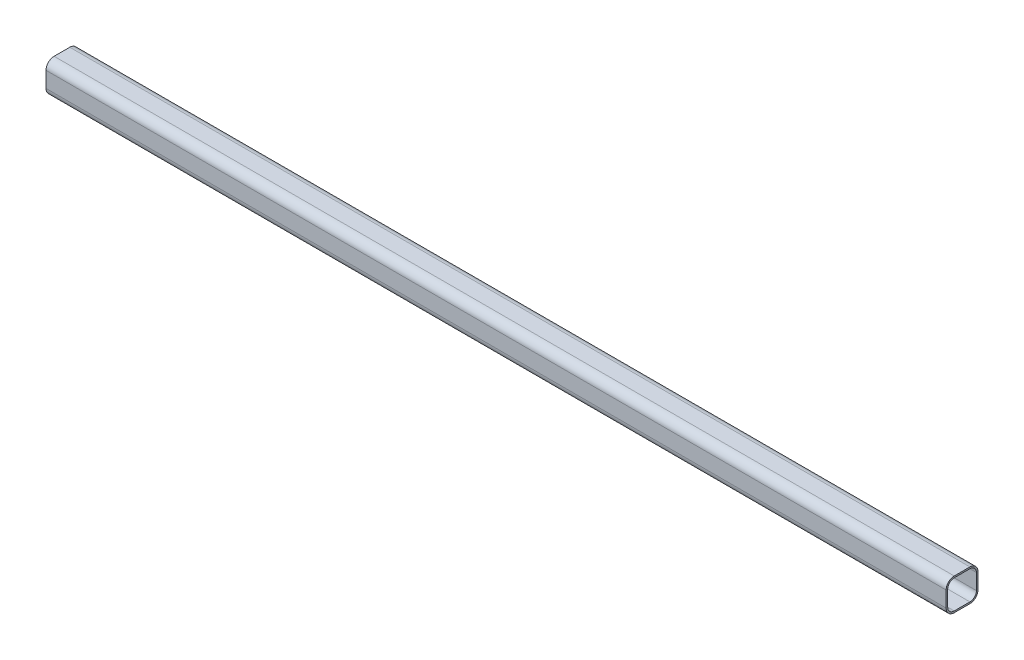
ISO-10303-21;
HEADER;
FILE_DESCRIPTION(('STEP AP214'),'2;1');
FILE_NAME('part.step','',(''),(''),'','','');
FILE_SCHEMA(('AUTOMOTIVE_DESIGN { 1 0 10303 214 1 1 1 1 }'));
ENDSEC;
DATA;
#1=APPLICATION_CONTEXT('core data for automotive mechanical design processes');
#2=APPLICATION_PROTOCOL_DEFINITION('international standard','automotive_design',2000,#1);
#3=PRODUCT_CONTEXT('',#1,'mechanical');
#4=PRODUCT('Part','Part','',(#3));
#5=PRODUCT_RELATED_PRODUCT_CATEGORY('part','',(#4));
#6=PRODUCT_DEFINITION_FORMATION('','',#4);
#7=PRODUCT_DEFINITION_CONTEXT('part definition',#1,'design');
#8=PRODUCT_DEFINITION('design','',#6,#7);
#9=PRODUCT_DEFINITION_SHAPE('','',#8);
#10=(LENGTH_UNIT() NAMED_UNIT(*) SI_UNIT(.MILLI.,.METRE.));
#11=(NAMED_UNIT(*) PLANE_ANGLE_UNIT() SI_UNIT($,.RADIAN.));
#12=(NAMED_UNIT(*) SI_UNIT($,.STERADIAN.) SOLID_ANGLE_UNIT());
#13=UNCERTAINTY_MEASURE_WITH_UNIT(LENGTH_MEASURE(1.E-05),#10,'distance_accuracy_value','');
#14=(GEOMETRIC_REPRESENTATION_CONTEXT(3) GLOBAL_UNCERTAINTY_ASSIGNED_CONTEXT((#13)) GLOBAL_UNIT_ASSIGNED_CONTEXT((#10,
#11,#12)) REPRESENTATION_CONTEXT('',''));
#15=CARTESIAN_POINT('',(0.,0.,0.));
#16=DIRECTION('',(0.,0.,1.));
#17=DIRECTION('',(1.,0.,0.));
#18=AXIS2_PLACEMENT_3D('',#15,#16,#17);
#19=CARTESIAN_POINT('',(788.364817461349,12.3,12.3));
#20=DIRECTION('',(-1.,0.,0.));
#21=DIRECTION('',(0.,0.,1.));
#22=AXIS2_PLACEMENT_3D('',#19,#20,#21);
#23=CYLINDRICAL_SURFACE('',#22,12.7);
#24=CARTESIAN_POINT('',(-623.635182538651,12.3,12.3));
#25=DIRECTION('',(1.,0.,0.));
#26=DIRECTION('',(0.,0.,-1.));
#27=AXIS2_PLACEMENT_3D('',#24,#25,#26);
#28=CIRCLE('',#27,12.7);
#29=CARTESIAN_POINT('',(-623.635182538651,25.,12.3));
#30=VERTEX_POINT('',#29);
#31=CARTESIAN_POINT('',(-623.635182538651,12.3,25.));
#32=VERTEX_POINT('',#31);
#33=EDGE_CURVE('E237',#30,#32,#28,.T.);
#34=ORIENTED_EDGE('',*,*,#33,.T.);
#35=DIRECTION('',(-1.,0.,0.));
#36=VECTOR('',#35,1.);
#37=CARTESIAN_POINT('',(788.364817461349,12.3,25.));
#38=LINE('',#37,#36);
#39=CARTESIAN_POINT('',(788.364817461349,12.3,25.));
#40=VERTEX_POINT('',#39);
#41=EDGE_CURVE('E12',#40,#32,#38,.T.);
#42=ORIENTED_EDGE('',*,*,#41,.F.);
#43=CARTESIAN_POINT('',(788.364817461349,12.3,12.3));
#44=DIRECTION('',(1.,0.,0.));
#45=DIRECTION('',(0.,0.,-1.));
#46=AXIS2_PLACEMENT_3D('',#43,#44,#45);
#47=CIRCLE('',#46,12.7);
#48=CARTESIAN_POINT('',(788.364817461349,25.,12.3));
#49=VERTEX_POINT('',#48);
#50=EDGE_CURVE('E315',#49,#40,#47,.T.);
#51=ORIENTED_EDGE('',*,*,#50,.F.);
#52=DIRECTION('',(-1.,0.,0.));
#53=VECTOR('',#52,1.);
#54=CARTESIAN_POINT('',(788.364817461349,25.,12.3));
#55=LINE('',#54,#53);
#56=EDGE_CURVE('E252',#49,#30,#55,.T.);
#57=ORIENTED_EDGE('',*,*,#56,.T.);
#58=EDGE_LOOP('',(#34,#42,#51,#57));
#59=FACE_BOUND('',#58,.T.);
#60=ADVANCED_FACE('F64',(#59),#23,.T.);
#61=CARTESIAN_POINT('',(788.364817461349,12.3,25.));
#62=DIRECTION('',(0.,0.,-1.));
#63=DIRECTION('',(-1.,0.,0.));
#64=AXIS2_PLACEMENT_3D('',#61,#62,#63);
#65=PLANE('',#64);
#66=DIRECTION('',(0.,-1.,0.));
#67=VECTOR('',#66,1.);
#68=CARTESIAN_POINT('',(-623.635182538651,12.3,25.));
#69=LINE('',#68,#67);
#70=CARTESIAN_POINT('',(-623.635182538651,-12.3,25.));
#71=VERTEX_POINT('',#70);
#72=EDGE_CURVE('E240',#32,#71,#69,.T.);
#73=ORIENTED_EDGE('',*,*,#72,.T.);
#74=DIRECTION('',(-1.,0.,0.));
#75=VECTOR('',#74,1.);
#76=CARTESIAN_POINT('',(788.364817461349,-12.3,25.));
#77=LINE('',#76,#75);
#78=CARTESIAN_POINT('',(788.364817461349,-12.3,25.));
#79=VERTEX_POINT('',#78);
#80=EDGE_CURVE('E74',#79,#71,#77,.T.);
#81=ORIENTED_EDGE('',*,*,#80,.F.);
#82=DIRECTION('',(0.,-1.,0.));
#83=VECTOR('',#82,1.);
#84=CARTESIAN_POINT('',(788.364817461349,12.3,25.));
#85=LINE('',#84,#83);
#86=EDGE_CURVE('E317',#40,#79,#85,.T.);
#87=ORIENTED_EDGE('',*,*,#86,.F.);
#88=ORIENTED_EDGE('',*,*,#41,.T.);
#89=EDGE_LOOP('',(#73,#81,#87,#88));
#90=FACE_BOUND('',#89,.T.);
#91=ADVANCED_FACE('F352',(#90),#65,.F.);
#92=CARTESIAN_POINT('',(788.364817461349,-12.3,12.3));
#93=DIRECTION('',(-1.,0.,0.));
#94=DIRECTION('',(0.,0.,1.));
#95=AXIS2_PLACEMENT_3D('',#92,#93,#94);
#96=CYLINDRICAL_SURFACE('',#95,12.7);
#97=CARTESIAN_POINT('',(-623.635182538651,-12.3,12.3));
#98=DIRECTION('',(1.,0.,0.));
#99=DIRECTION('',(0.,0.,-1.));
#100=AXIS2_PLACEMENT_3D('',#97,#98,#99);
#101=CIRCLE('',#100,12.7);
#102=CARTESIAN_POINT('',(-623.635182538651,-25.,12.3));
#103=VERTEX_POINT('',#102);
#104=EDGE_CURVE('E242',#71,#103,#101,.T.);
#105=ORIENTED_EDGE('',*,*,#104,.T.);
#106=DIRECTION('',(-1.,0.,0.));
#107=VECTOR('',#106,1.);
#108=CARTESIAN_POINT('',(788.364817461349,-25.,12.3));
#109=LINE('',#108,#107);
#110=CARTESIAN_POINT('',(788.364817461349,-25.,12.3));
#111=VERTEX_POINT('',#110);
#112=EDGE_CURVE('E259',#111,#103,#109,.T.);
#113=ORIENTED_EDGE('',*,*,#112,.F.);
#114=CARTESIAN_POINT('',(788.364817461349,-12.3,12.3));
#115=DIRECTION('',(1.,0.,0.));
#116=DIRECTION('',(0.,0.,-1.));
#117=AXIS2_PLACEMENT_3D('',#114,#115,#116);
#118=CIRCLE('',#117,12.7);
#119=EDGE_CURVE('E319',#79,#111,#118,.T.);
#120=ORIENTED_EDGE('',*,*,#119,.F.);
#121=ORIENTED_EDGE('',*,*,#80,.T.);
#122=EDGE_LOOP('',(#105,#113,#120,#121));
#123=FACE_BOUND('',#122,.T.);
#124=ADVANCED_FACE('F357',(#123),#96,.T.);
#125=CARTESIAN_POINT('',(788.364817461349,-25.,-12.3));
#126=DIRECTION('',(0.,1.,0.));
#127=DIRECTION('',(0.,0.,1.));
#128=AXIS2_PLACEMENT_3D('',#125,#126,#127);
#129=PLANE('',#128);
#130=CARTESIAN_POINT('',(152.364817461349,-25.,0.));
#131=DIRECTION('',(0.,-1.,0.));
#132=DIRECTION('',(0.,0.,-1.));
#133=AXIS2_PLACEMENT_3D('',#130,#131,#132);
#134=CIRCLE('',#133,8.74999999999998);
#135=CARTESIAN_POINT('',(152.364817461349,-25.,-8.74999999999996));
#136=VERTEX_POINT('',#135);
#137=EDGE_CURVE('E511',#136,#136,#134,.T.);
#138=ORIENTED_EDGE('',*,*,#137,.F.);
#139=EDGE_LOOP('',(#138));
#140=FACE_BOUND('',#139,.T.);
#141=CARTESIAN_POINT('',(212.364817461349,-25.,0.));
#142=DIRECTION('',(0.,-1.,0.));
#143=DIRECTION('',(0.,0.,-1.));
#144=AXIS2_PLACEMENT_3D('',#141,#142,#143);
#145=CIRCLE('',#144,8.74999999999998);
#146=CARTESIAN_POINT('',(212.364817461349,-25.,-8.74999999999996));
#147=VERTEX_POINT('',#146);
#148=EDGE_CURVE('E515',#147,#147,#145,.T.);
#149=ORIENTED_EDGE('',*,*,#148,.F.);
#150=EDGE_LOOP('',(#149));
#151=FACE_BOUND('',#150,.T.);
#152=DIRECTION('',(0.,0.,-1.));
#153=VECTOR('',#152,1.);
#154=CARTESIAN_POINT('',(-623.635182538651,-25.,-12.3));
#155=LINE('',#154,#153);
#156=CARTESIAN_POINT('',(-623.635182538651,-25.,-12.3));
#157=VERTEX_POINT('',#156);
#158=EDGE_CURVE('E244',#103,#157,#155,.T.);
#159=ORIENTED_EDGE('',*,*,#158,.T.);
#160=DIRECTION('',(-1.,0.,0.));
#161=VECTOR('',#160,1.);
#162=CARTESIAN_POINT('',(788.364817461349,-25.,-12.3));
#163=LINE('',#162,#161);
#164=CARTESIAN_POINT('',(788.364817461349,-25.,-12.3));
#165=VERTEX_POINT('',#164);
#166=EDGE_CURVE('E256',#165,#157,#163,.T.);
#167=ORIENTED_EDGE('',*,*,#166,.F.);
#168=DIRECTION('',(0.,0.,-1.));
#169=VECTOR('',#168,1.);
#170=CARTESIAN_POINT('',(788.364817461349,-25.,-12.3));
#171=LINE('',#170,#169);
#172=EDGE_CURVE('E321',#111,#165,#171,.T.);
#173=ORIENTED_EDGE('',*,*,#172,.F.);
#174=ORIENTED_EDGE('',*,*,#112,.T.);
#175=EDGE_LOOP('',(#159,#167,#173,#174));
#176=FACE_BOUND('',#175,.T.);
#177=ADVANCED_FACE('F327',(#140,#151,#176),#129,.F.);
#178=CARTESIAN_POINT('',(788.364817461349,-12.3,-12.3));
#179=DIRECTION('',(-1.,0.,0.));
#180=DIRECTION('',(0.,0.,1.));
#181=AXIS2_PLACEMENT_3D('',#178,#179,#180);
#182=CYLINDRICAL_SURFACE('',#181,12.7);
#183=CARTESIAN_POINT('',(-623.635182538651,-12.3,-12.3));
#184=DIRECTION('',(1.,0.,0.));
#185=DIRECTION('',(0.,0.,-1.));
#186=AXIS2_PLACEMENT_3D('',#183,#184,#185);
#187=CIRCLE('',#186,12.7);
#188=CARTESIAN_POINT('',(-623.635182538651,-12.3,-25.));
#189=VERTEX_POINT('',#188);
#190=EDGE_CURVE('E246',#157,#189,#187,.T.);
#191=ORIENTED_EDGE('',*,*,#190,.T.);
#192=DIRECTION('',(-1.,0.,0.));
#193=VECTOR('',#192,1.);
#194=CARTESIAN_POINT('',(788.364817461349,-12.3,-25.));
#195=LINE('',#194,#193);
#196=CARTESIAN_POINT('',(788.364817461349,-12.3,-25.));
#197=VERTEX_POINT('',#196);
#198=EDGE_CURVE('E203',#197,#189,#195,.T.);
#199=ORIENTED_EDGE('',*,*,#198,.F.);
#200=CARTESIAN_POINT('',(788.364817461349,-12.3,-12.3));
#201=DIRECTION('',(1.,0.,0.));
#202=DIRECTION('',(0.,0.,-1.));
#203=AXIS2_PLACEMENT_3D('',#200,#201,#202);
#204=CIRCLE('',#203,12.7);
#205=EDGE_CURVE('E194',#165,#197,#204,.T.);
#206=ORIENTED_EDGE('',*,*,#205,.F.);
#207=ORIENTED_EDGE('',*,*,#166,.T.);
#208=EDGE_LOOP('',(#191,#199,#206,#207));
#209=FACE_BOUND('',#208,.T.);
#210=ADVANCED_FACE('F331',(#209),#182,.T.);
#211=CARTESIAN_POINT('',(788.364817461349,-12.3,-25.));
#212=DIRECTION('',(0.,0.,1.));
#213=DIRECTION('',(1.,0.,0.));
#214=AXIS2_PLACEMENT_3D('',#211,#212,#213);
#215=PLANE('',#214);
#216=DIRECTION('',(0.,1.,0.));
#217=VECTOR('',#216,1.);
#218=CARTESIAN_POINT('',(-623.635182538651,-12.3,-25.));
#219=LINE('',#218,#217);
#220=CARTESIAN_POINT('',(-623.635182538651,12.3,-25.));
#221=VERTEX_POINT('',#220);
#222=EDGE_CURVE('E202',#189,#221,#219,.T.);
#223=ORIENTED_EDGE('',*,*,#222,.T.);
#224=DIRECTION('',(-1.,0.,0.));
#225=VECTOR('',#224,1.);
#226=CARTESIAN_POINT('',(788.364817461349,12.3,-25.));
#227=LINE('',#226,#225);
#228=CARTESIAN_POINT('',(788.364817461349,12.3,-25.));
#229=VERTEX_POINT('',#228);
#230=EDGE_CURVE('E199',#229,#221,#227,.T.);
#231=ORIENTED_EDGE('',*,*,#230,.F.);
#232=DIRECTION('',(0.,1.,0.));
#233=VECTOR('',#232,1.);
#234=CARTESIAN_POINT('',(788.364817461349,-12.3,-25.));
#235=LINE('',#234,#233);
#236=EDGE_CURVE('E188',#197,#229,#235,.T.);
#237=ORIENTED_EDGE('',*,*,#236,.F.);
#238=ORIENTED_EDGE('',*,*,#198,.T.);
#239=EDGE_LOOP('',(#223,#231,#237,#238));
#240=FACE_BOUND('',#239,.T.);
#241=ADVANCED_FACE('F200',(#240),#215,.F.);
#242=CARTESIAN_POINT('',(788.364817461349,12.3,-12.3));
#243=DIRECTION('',(-1.,0.,0.));
#244=DIRECTION('',(0.,0.,1.));
#245=AXIS2_PLACEMENT_3D('',#242,#243,#244);
#246=CYLINDRICAL_SURFACE('',#245,12.7);
#247=CARTESIAN_POINT('',(-623.635182538651,12.3,-12.3));
#248=DIRECTION('',(1.,0.,0.));
#249=DIRECTION('',(0.,0.,-1.));
#250=AXIS2_PLACEMENT_3D('',#247,#248,#249);
#251=CIRCLE('',#250,12.7);
#252=CARTESIAN_POINT('',(-623.635182538651,25.,-12.3));
#253=VERTEX_POINT('',#252);
#254=EDGE_CURVE('E136',#221,#253,#251,.T.);
#255=ORIENTED_EDGE('',*,*,#254,.T.);
#256=DIRECTION('',(-1.,0.,0.));
#257=VECTOR('',#256,1.);
#258=CARTESIAN_POINT('',(788.364817461349,25.,-12.3));
#259=LINE('',#258,#257);
#260=CARTESIAN_POINT('',(788.364817461349,25.,-12.3));
#261=VERTEX_POINT('',#260);
#262=EDGE_CURVE('E204',#261,#253,#259,.T.);
#263=ORIENTED_EDGE('',*,*,#262,.F.);
#264=CARTESIAN_POINT('',(788.364817461349,12.3,-12.3));
#265=DIRECTION('',(1.,0.,0.));
#266=DIRECTION('',(0.,0.,-1.));
#267=AXIS2_PLACEMENT_3D('',#264,#265,#266);
#268=CIRCLE('',#267,12.7);
#269=EDGE_CURVE('E192',#229,#261,#268,.T.);
#270=ORIENTED_EDGE('',*,*,#269,.F.);
#271=ORIENTED_EDGE('',*,*,#230,.T.);
#272=EDGE_LOOP('',(#255,#263,#270,#271));
#273=FACE_BOUND('',#272,.T.);
#274=ADVANCED_FACE('F206',(#273),#246,.T.);
#275=CARTESIAN_POINT('',(788.364817461349,-12.3,12.3));
#276=DIRECTION('',(-1.,0.,0.));
#277=DIRECTION('',(0.,0.,1.));
#278=AXIS2_PLACEMENT_3D('',#275,#276,#277);
#279=CYLINDRICAL_SURFACE('',#278,10.2);
#280=CARTESIAN_POINT('',(-623.635182538651,-12.3,12.3));
#281=DIRECTION('',(1.,0.,0.));
#282=DIRECTION('',(0.,0.,-1.));
#283=AXIS2_PLACEMENT_3D('',#280,#281,#282);
#284=CIRCLE('',#283,10.2);
#285=CARTESIAN_POINT('',(-623.635182538651,-12.3,22.5));
#286=VERTEX_POINT('',#285);
#287=CARTESIAN_POINT('',(-623.635182538651,-22.5,12.3));
#288=VERTEX_POINT('',#287);
#289=EDGE_CURVE('E212',#286,#288,#284,.T.);
#290=ORIENTED_EDGE('',*,*,#289,.F.);
#291=DIRECTION('',(-1.,0.,0.));
#292=VECTOR('',#291,1.);
#293=CARTESIAN_POINT('',(788.364817461349,-12.3,22.5));
#294=LINE('',#293,#292);
#295=CARTESIAN_POINT('',(788.364817461349,-12.3,22.5));
#296=VERTEX_POINT('',#295);
#297=EDGE_CURVE('E68',#296,#286,#294,.T.);
#298=ORIENTED_EDGE('',*,*,#297,.F.);
#299=CARTESIAN_POINT('',(788.364817461349,-12.3,12.3));
#300=DIRECTION('',(1.,0.,0.));
#301=DIRECTION('',(0.,0.,-1.));
#302=AXIS2_PLACEMENT_3D('',#299,#300,#301);
#303=CIRCLE('',#302,10.2);
#304=CARTESIAN_POINT('',(788.364817461349,-22.5,12.3));
#305=VERTEX_POINT('',#304);
#306=EDGE_CURVE('E251',#296,#305,#303,.T.);
#307=ORIENTED_EDGE('',*,*,#306,.T.);
#308=DIRECTION('',(-1.,0.,0.));
#309=VECTOR('',#308,1.);
#310=CARTESIAN_POINT('',(788.364817461349,-22.5,12.3));
#311=LINE('',#310,#309);
#312=EDGE_CURVE('E208',#305,#288,#311,.T.);
#313=ORIENTED_EDGE('',*,*,#312,.T.);
#314=EDGE_LOOP('',(#290,#298,#307,#313));
#315=FACE_BOUND('',#314,.T.);
#316=ADVANCED_FACE('F66',(#315),#279,.F.);
#317=CARTESIAN_POINT('',(788.364817461349,12.3,22.5));
#318=DIRECTION('',(0.,0.,-1.));
#319=DIRECTION('',(-1.,0.,0.));
#320=AXIS2_PLACEMENT_3D('',#317,#318,#319);
#321=PLANE('',#320);
#322=DIRECTION('',(0.,-1.,0.));
#323=VECTOR('',#322,1.);
#324=CARTESIAN_POINT('',(-623.635182538651,12.3,22.5));
#325=LINE('',#324,#323);
#326=CARTESIAN_POINT('',(-623.635182538651,12.3,22.5));
#327=VERTEX_POINT('',#326);
#328=EDGE_CURVE('E215',#327,#286,#325,.T.);
#329=ORIENTED_EDGE('',*,*,#328,.F.);
#330=DIRECTION('',(-1.,0.,0.));
#331=VECTOR('',#330,1.);
#332=CARTESIAN_POINT('',(788.364817461349,12.3,22.5));
#333=LINE('',#332,#331);
#334=CARTESIAN_POINT('',(788.364817461349,12.3,22.5));
#335=VERTEX_POINT('',#334);
#336=EDGE_CURVE('E274',#335,#327,#333,.T.);
#337=ORIENTED_EDGE('',*,*,#336,.F.);
#338=DIRECTION('',(0.,-1.,0.));
#339=VECTOR('',#338,1.);
#340=CARTESIAN_POINT('',(788.364817461349,12.3,22.5));
#341=LINE('',#340,#339);
#342=EDGE_CURVE('E283',#335,#296,#341,.T.);
#343=ORIENTED_EDGE('',*,*,#342,.T.);
#344=ORIENTED_EDGE('',*,*,#297,.T.);
#345=EDGE_LOOP('',(#329,#337,#343,#344));
#346=FACE_BOUND('',#345,.T.);
#347=ADVANCED_FACE('F281',(#346),#321,.T.);
#348=CARTESIAN_POINT('',(788.364817461349,12.3,12.3));
#349=DIRECTION('',(-1.,0.,0.));
#350=DIRECTION('',(0.,0.,1.));
#351=AXIS2_PLACEMENT_3D('',#348,#349,#350);
#352=CYLINDRICAL_SURFACE('',#351,10.2);
#353=CARTESIAN_POINT('',(-623.635182538651,12.3,12.3));
#354=DIRECTION('',(1.,0.,0.));
#355=DIRECTION('',(0.,0.,-1.));
#356=AXIS2_PLACEMENT_3D('',#353,#354,#355);
#357=CIRCLE('',#356,10.2);
#358=CARTESIAN_POINT('',(-623.635182538651,22.5,12.3));
#359=VERTEX_POINT('',#358);
#360=EDGE_CURVE('E219',#359,#327,#357,.T.);
#361=ORIENTED_EDGE('',*,*,#360,.F.);
#362=DIRECTION('',(-1.,0.,0.));
#363=VECTOR('',#362,1.);
#364=CARTESIAN_POINT('',(788.364817461349,22.5,12.3));
#365=LINE('',#364,#363);
#366=CARTESIAN_POINT('',(788.364817461349,22.5,12.3));
#367=VERTEX_POINT('',#366);
#368=EDGE_CURVE('E273',#367,#359,#365,.T.);
#369=ORIENTED_EDGE('',*,*,#368,.F.);
#370=CARTESIAN_POINT('',(788.364817461349,12.3,12.3));
#371=DIRECTION('',(1.,0.,0.));
#372=DIRECTION('',(0.,0.,-1.));
#373=AXIS2_PLACEMENT_3D('',#370,#371,#372);
#374=CIRCLE('',#373,10.2);
#375=EDGE_CURVE('E291',#367,#335,#374,.T.);
#376=ORIENTED_EDGE('',*,*,#375,.T.);
#377=ORIENTED_EDGE('',*,*,#336,.T.);
#378=EDGE_LOOP('',(#361,#369,#376,#377));
#379=FACE_BOUND('',#378,.T.);
#380=ADVANCED_FACE('F289',(#379),#352,.F.);
#381=CARTESIAN_POINT('',(788.364817461349,22.5,12.3));
#382=DIRECTION('',(0.,-1.,0.));
#383=DIRECTION('',(0.,0.,-1.));
#384=AXIS2_PLACEMENT_3D('',#381,#382,#383);
#385=PLANE('',#384);
#386=DIRECTION('',(0.,0.,1.));
#387=VECTOR('',#386,1.);
#388=CARTESIAN_POINT('',(-623.635182538651,22.5,12.3));
#389=LINE('',#388,#387);
#390=CARTESIAN_POINT('',(-623.635182538651,22.5,-12.3));
#391=VERTEX_POINT('',#390);
#392=EDGE_CURVE('E222',#391,#359,#389,.T.);
#393=ORIENTED_EDGE('',*,*,#392,.F.);
#394=DIRECTION('',(-1.,0.,0.));
#395=VECTOR('',#394,1.);
#396=CARTESIAN_POINT('',(788.364817461349,22.5,-12.3));
#397=LINE('',#396,#395);
#398=CARTESIAN_POINT('',(788.364817461349,22.5,-12.3));
#399=VERTEX_POINT('',#398);
#400=EDGE_CURVE('E271',#399,#391,#397,.T.);
#401=ORIENTED_EDGE('',*,*,#400,.F.);
#402=DIRECTION('',(0.,0.,1.));
#403=VECTOR('',#402,1.);
#404=CARTESIAN_POINT('',(788.364817461349,22.5,12.3));
#405=LINE('',#404,#403);
#406=EDGE_CURVE('E297',#399,#367,#405,.T.);
#407=ORIENTED_EDGE('',*,*,#406,.T.);
#408=ORIENTED_EDGE('',*,*,#368,.T.);
#409=EDGE_LOOP('',(#393,#401,#407,#408));
#410=FACE_BOUND('',#409,.T.);
#411=ADVANCED_FACE('F300',(#410),#385,.T.);
#412=CARTESIAN_POINT('',(788.364817461349,12.3,-12.3));
#413=DIRECTION('',(-1.,0.,0.));
#414=DIRECTION('',(0.,0.,1.));
#415=AXIS2_PLACEMENT_3D('',#412,#413,#414);
#416=CYLINDRICAL_SURFACE('',#415,10.2);
#417=CARTESIAN_POINT('',(-623.635182538651,12.3,-12.3));
#418=DIRECTION('',(1.,0.,0.));
#419=DIRECTION('',(0.,0.,-1.));
#420=AXIS2_PLACEMENT_3D('',#417,#418,#419);
#421=CIRCLE('',#420,10.2);
#422=CARTESIAN_POINT('',(-623.635182538651,12.3,-22.5));
#423=VERTEX_POINT('',#422);
#424=EDGE_CURVE('E225',#423,#391,#421,.T.);
#425=ORIENTED_EDGE('',*,*,#424,.F.);
#426=DIRECTION('',(-1.,0.,0.));
#427=VECTOR('',#426,1.);
#428=CARTESIAN_POINT('',(788.364817461349,12.3,-22.5));
#429=LINE('',#428,#427);
#430=CARTESIAN_POINT('',(788.364817461349,12.3,-22.5));
#431=VERTEX_POINT('',#430);
#432=EDGE_CURVE('E269',#431,#423,#429,.T.);
#433=ORIENTED_EDGE('',*,*,#432,.F.);
#434=CARTESIAN_POINT('',(788.364817461349,12.3,-12.3));
#435=DIRECTION('',(1.,0.,0.));
#436=DIRECTION('',(0.,0.,-1.));
#437=AXIS2_PLACEMENT_3D('',#434,#435,#436);
#438=CIRCLE('',#437,10.2);
#439=EDGE_CURVE('E301',#431,#399,#438,.T.);
#440=ORIENTED_EDGE('',*,*,#439,.T.);
#441=ORIENTED_EDGE('',*,*,#400,.T.);
#442=EDGE_LOOP('',(#425,#433,#440,#441));
#443=FACE_BOUND('',#442,.T.);
#444=ADVANCED_FACE('F368',(#443),#416,.F.);
#445=CARTESIAN_POINT('',(788.364817461349,-12.3,-22.5));
#446=DIRECTION('',(0.,0.,1.));
#447=DIRECTION('',(1.,0.,0.));
#448=AXIS2_PLACEMENT_3D('',#445,#446,#447);
#449=PLANE('',#448);
#450=DIRECTION('',(0.,1.,0.));
#451=VECTOR('',#450,1.);
#452=CARTESIAN_POINT('',(-623.635182538651,-12.3,-22.5));
#453=LINE('',#452,#451);
#454=CARTESIAN_POINT('',(-623.635182538651,-12.3,-22.5));
#455=VERTEX_POINT('',#454);
#456=EDGE_CURVE('E228',#455,#423,#453,.T.);
#457=ORIENTED_EDGE('',*,*,#456,.F.);
#458=DIRECTION('',(-1.,0.,0.));
#459=VECTOR('',#458,1.);
#460=CARTESIAN_POINT('',(788.364817461349,-12.3,-22.5));
#461=LINE('',#460,#459);
#462=CARTESIAN_POINT('',(788.364817461349,-12.3,-22.5));
#463=VERTEX_POINT('',#462);
#464=EDGE_CURVE('E267',#463,#455,#461,.T.);
#465=ORIENTED_EDGE('',*,*,#464,.F.);
#466=DIRECTION('',(0.,1.,0.));
#467=VECTOR('',#466,1.);
#468=CARTESIAN_POINT('',(788.364817461349,-12.3,-22.5));
#469=LINE('',#468,#467);
#470=EDGE_CURVE('E303',#463,#431,#469,.T.);
#471=ORIENTED_EDGE('',*,*,#470,.T.);
#472=ORIENTED_EDGE('',*,*,#432,.T.);
#473=EDGE_LOOP('',(#457,#465,#471,#472));
#474=FACE_BOUND('',#473,.T.);
#475=ADVANCED_FACE('F364',(#474),#449,.T.);
#476=CARTESIAN_POINT('',(788.364817461349,-12.3,-12.3));
#477=DIRECTION('',(-1.,0.,0.));
#478=DIRECTION('',(0.,0.,1.));
#479=AXIS2_PLACEMENT_3D('',#476,#477,#478);
#480=CYLINDRICAL_SURFACE('',#479,10.2);
#481=CARTESIAN_POINT('',(-623.635182538651,-12.3,-12.3));
#482=DIRECTION('',(1.,0.,0.));
#483=DIRECTION('',(0.,0.,-1.));
#484=AXIS2_PLACEMENT_3D('',#481,#482,#483);
#485=CIRCLE('',#484,10.2);
#486=CARTESIAN_POINT('',(-623.635182538651,-22.5,-12.3));
#487=VERTEX_POINT('',#486);
#488=EDGE_CURVE('E231',#487,#455,#485,.T.);
#489=ORIENTED_EDGE('',*,*,#488,.F.);
#490=DIRECTION('',(-1.,0.,0.));
#491=VECTOR('',#490,1.);
#492=CARTESIAN_POINT('',(788.364817461349,-22.5,-12.3));
#493=LINE('',#492,#491);
#494=CARTESIAN_POINT('',(788.364817461349,-22.5,-12.3));
#495=VERTEX_POINT('',#494);
#496=EDGE_CURVE('E265',#495,#487,#493,.T.);
#497=ORIENTED_EDGE('',*,*,#496,.F.);
#498=CARTESIAN_POINT('',(788.364817461349,-12.3,-12.3));
#499=DIRECTION('',(1.,0.,0.));
#500=DIRECTION('',(0.,0.,-1.));
#501=AXIS2_PLACEMENT_3D('',#498,#499,#500);
#502=CIRCLE('',#501,10.2);
#503=EDGE_CURVE('E309',#495,#463,#502,.T.);
#504=ORIENTED_EDGE('',*,*,#503,.T.);
#505=ORIENTED_EDGE('',*,*,#464,.T.);
#506=EDGE_LOOP('',(#489,#497,#504,#505));
#507=FACE_BOUND('',#506,.T.);
#508=ADVANCED_FACE('F346',(#507),#480,.F.);
#509=CARTESIAN_POINT('',(788.364817461349,-22.5,-12.3));
#510=DIRECTION('',(0.,1.,0.));
#511=DIRECTION('',(0.,0.,1.));
#512=AXIS2_PLACEMENT_3D('',#509,#510,#511);
#513=PLANE('',#512);
#514=CARTESIAN_POINT('',(152.364817461349,-22.5,0.));
#515=DIRECTION('',(0.,1.,0.));
#516=DIRECTION('',(0.,0.,1.));
#517=AXIS2_PLACEMENT_3D('',#514,#515,#516);
#518=CIRCLE('',#517,8.74999999999999);
#519=CARTESIAN_POINT('',(152.364817461349,-22.5,8.75000000000001));
#520=VERTEX_POINT('',#519);
#521=EDGE_CURVE('E514',#520,#520,#518,.T.);
#522=ORIENTED_EDGE('',*,*,#521,.F.);
#523=EDGE_LOOP('',(#522));
#524=FACE_BOUND('',#523,.T.);
#525=CARTESIAN_POINT('',(212.364817461349,-22.5,0.));
#526=DIRECTION('',(0.,1.,0.));
#527=DIRECTION('',(0.,0.,1.));
#528=AXIS2_PLACEMENT_3D('',#525,#526,#527);
#529=CIRCLE('',#528,8.74999999999999);
#530=CARTESIAN_POINT('',(212.364817461349,-22.5,8.75000000000001));
#531=VERTEX_POINT('',#530);
#532=EDGE_CURVE('E216',#531,#531,#529,.T.);
#533=ORIENTED_EDGE('',*,*,#532,.F.);
#534=EDGE_LOOP('',(#533));
#535=FACE_BOUND('',#534,.T.);
#536=DIRECTION('',(0.,0.,-1.));
#537=VECTOR('',#536,1.);
#538=CARTESIAN_POINT('',(-623.635182538651,-22.5,-12.3));
#539=LINE('',#538,#537);
#540=EDGE_CURVE('E234',#288,#487,#539,.T.);
#541=ORIENTED_EDGE('',*,*,#540,.F.);
#542=ORIENTED_EDGE('',*,*,#312,.F.);
#543=DIRECTION('',(0.,0.,-1.));
#544=VECTOR('',#543,1.);
#545=CARTESIAN_POINT('',(788.364817461349,-22.5,-12.3));
#546=LINE('',#545,#544);
#547=EDGE_CURVE('E312',#305,#495,#546,.T.);
#548=ORIENTED_EDGE('',*,*,#547,.T.);
#549=ORIENTED_EDGE('',*,*,#496,.T.);
#550=EDGE_LOOP('',(#541,#542,#548,#549));
#551=FACE_BOUND('',#550,.T.);
#552=ADVANCED_FACE('F339',(#524,#535,#551),#513,.T.);
#553=CARTESIAN_POINT('',(788.364817461349,25.,12.3));
#554=DIRECTION('',(0.,-1.,0.));
#555=DIRECTION('',(0.,0.,-1.));
#556=AXIS2_PLACEMENT_3D('',#553,#554,#555);
#557=PLANE('',#556);
#558=DIRECTION('',(0.,0.,1.));
#559=VECTOR('',#558,1.);
#560=CARTESIAN_POINT('',(-623.635182538651,25.,12.3));
#561=LINE('',#560,#559);
#562=EDGE_CURVE('E142',#253,#30,#561,.T.);
#563=ORIENTED_EDGE('',*,*,#562,.T.);
#564=ORIENTED_EDGE('',*,*,#56,.F.);
#565=DIRECTION('',(0.,0.,1.));
#566=VECTOR('',#565,1.);
#567=CARTESIAN_POINT('',(788.364817461349,25.,12.3));
#568=LINE('',#567,#566);
#569=EDGE_CURVE('E83',#261,#49,#568,.T.);
#570=ORIENTED_EDGE('',*,*,#569,.F.);
#571=ORIENTED_EDGE('',*,*,#262,.T.);
#572=EDGE_LOOP('',(#563,#564,#570,#571));
#573=FACE_BOUND('',#572,.T.);
#574=ADVANCED_FACE('F337',(#573),#557,.F.);
#575=CARTESIAN_POINT('',(788.364817461349,12.3,12.3));
#576=DIRECTION('',(1.,0.,0.));
#577=DIRECTION('',(0.,0.,-1.));
#578=AXIS2_PLACEMENT_3D('',#575,#576,#577);
#579=PLANE('',#578);
#580=ORIENTED_EDGE('',*,*,#306,.F.);
#581=ORIENTED_EDGE('',*,*,#342,.F.);
#582=ORIENTED_EDGE('',*,*,#375,.F.);
#583=ORIENTED_EDGE('',*,*,#406,.F.);
#584=ORIENTED_EDGE('',*,*,#439,.F.);
#585=ORIENTED_EDGE('',*,*,#470,.F.);
#586=ORIENTED_EDGE('',*,*,#503,.F.);
#587=ORIENTED_EDGE('',*,*,#547,.F.);
#588=EDGE_LOOP('',(#580,#581,#582,#583,#584,#585,#586,#587));
#589=FACE_BOUND('',#588,.T.);
#590=ORIENTED_EDGE('',*,*,#50,.T.);
#591=ORIENTED_EDGE('',*,*,#86,.T.);
#592=ORIENTED_EDGE('',*,*,#119,.T.);
#593=ORIENTED_EDGE('',*,*,#172,.T.);
#594=ORIENTED_EDGE('',*,*,#205,.T.);
#595=ORIENTED_EDGE('',*,*,#236,.T.);
#596=ORIENTED_EDGE('',*,*,#269,.T.);
#597=ORIENTED_EDGE('',*,*,#569,.T.);
#598=EDGE_LOOP('',(#590,#591,#592,#593,#594,#595,#596,#597));
#599=FACE_BOUND('',#598,.T.);
#600=ADVANCED_FACE('F190',(#589,#599),#579,.T.);
#601=CARTESIAN_POINT('',(-623.635182538651,12.3,12.3));
#602=DIRECTION('',(1.,0.,0.));
#603=DIRECTION('',(0.,0.,-1.));
#604=AXIS2_PLACEMENT_3D('',#601,#602,#603);
#605=PLANE('',#604);
#606=ORIENTED_EDGE('',*,*,#289,.T.);
#607=ORIENTED_EDGE('',*,*,#540,.T.);
#608=ORIENTED_EDGE('',*,*,#488,.T.);
#609=ORIENTED_EDGE('',*,*,#456,.T.);
#610=ORIENTED_EDGE('',*,*,#424,.T.);
#611=ORIENTED_EDGE('',*,*,#392,.T.);
#612=ORIENTED_EDGE('',*,*,#360,.T.);
#613=ORIENTED_EDGE('',*,*,#328,.T.);
#614=EDGE_LOOP('',(#606,#607,#608,#609,#610,#611,#612,#613));
#615=FACE_BOUND('',#614,.T.);
#616=ORIENTED_EDGE('',*,*,#33,.F.);
#617=ORIENTED_EDGE('',*,*,#562,.F.);
#618=ORIENTED_EDGE('',*,*,#254,.F.);
#619=ORIENTED_EDGE('',*,*,#222,.F.);
#620=ORIENTED_EDGE('',*,*,#190,.F.);
#621=ORIENTED_EDGE('',*,*,#158,.F.);
#622=ORIENTED_EDGE('',*,*,#104,.F.);
#623=ORIENTED_EDGE('',*,*,#72,.F.);
#624=EDGE_LOOP('',(#616,#617,#618,#619,#620,#621,#622,#623));
#625=FACE_BOUND('',#624,.T.);
#626=ADVANCED_FACE('F286',(#615,#625),#605,.F.);
#627=CARTESIAN_POINT('',(212.364817461349,-25.,0.));
#628=DIRECTION('',(0.,-1.,0.));
#629=DIRECTION('',(0.,0.,-1.));
#630=AXIS2_PLACEMENT_3D('',#627,#628,#629);
#631=CYLINDRICAL_SURFACE('',#630,8.74999999999999);
#632=ORIENTED_EDGE('',*,*,#148,.T.);
#633=EDGE_LOOP('',(#632));
#634=FACE_BOUND('',#633,.T.);
#635=ORIENTED_EDGE('',*,*,#532,.T.);
#636=EDGE_LOOP('',(#635));
#637=FACE_BOUND('',#636,.T.);
#638=ADVANCED_FACE('F484',(#634,#637),#631,.F.);
#639=CARTESIAN_POINT('',(152.364817461349,-25.,0.));
#640=DIRECTION('',(0.,-1.,0.));
#641=DIRECTION('',(0.,0.,-1.));
#642=AXIS2_PLACEMENT_3D('',#639,#640,#641);
#643=CYLINDRICAL_SURFACE('',#642,8.74999999999999);
#644=ORIENTED_EDGE('',*,*,#137,.T.);
#645=EDGE_LOOP('',(#644));
#646=FACE_BOUND('',#645,.T.);
#647=ORIENTED_EDGE('',*,*,#521,.T.);
#648=EDGE_LOOP('',(#647));
#649=FACE_BOUND('',#648,.T.);
#650=ADVANCED_FACE('F494',(#646,#649),#643,.F.);
#651=CLOSED_SHELL('',(#60,#91,#124,#177,#210,#241,#274,#316,#347,#380,#411,#444,#475,#508,#552,
#574,#600,#626,#638,#650));
#652=MANIFOLD_SOLID_BREP('B2',#651);
#653=ADVANCED_BREP_SHAPE_REPRESENTATION('',(#18,#652),#14);
#654=SHAPE_DEFINITION_REPRESENTATION(#9,#653);
ENDSEC;
END-ISO-10303-21;
